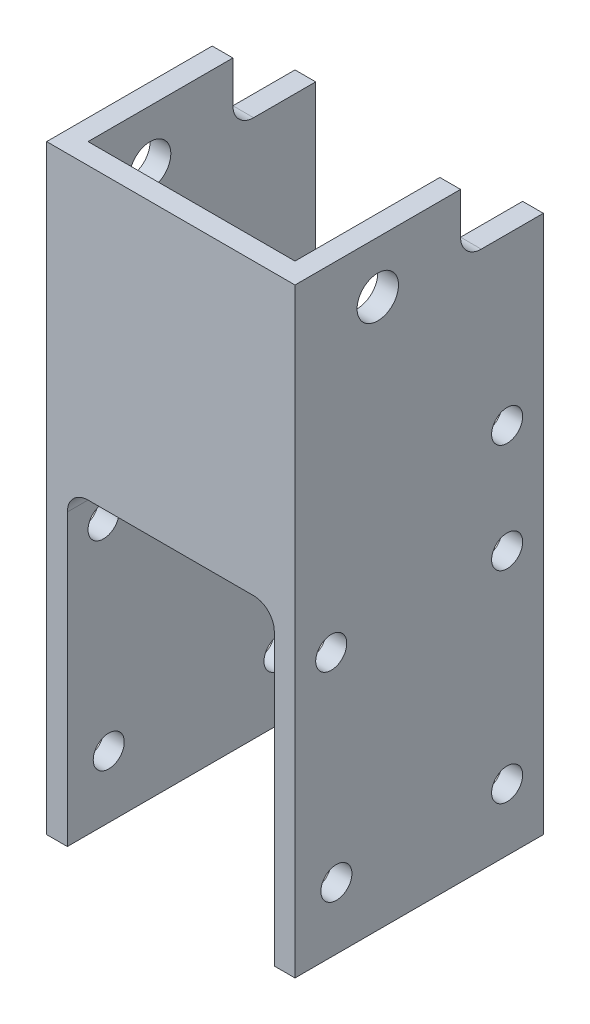
ISO-10303-21;
HEADER;
FILE_DESCRIPTION(('STEP AP214'),'2;1');
FILE_NAME('part.step','',(''),(''),'','','');
FILE_SCHEMA(('AUTOMOTIVE_DESIGN { 1 0 10303 214 1 1 1 1 }'));
ENDSEC;
DATA;
#1=APPLICATION_CONTEXT('core data for automotive mechanical design processes');
#2=APPLICATION_PROTOCOL_DEFINITION('international standard','automotive_design',2000,#1);
#3=PRODUCT_CONTEXT('',#1,'mechanical');
#4=PRODUCT('Part','Part','',(#3));
#5=PRODUCT_RELATED_PRODUCT_CATEGORY('part','',(#4));
#6=PRODUCT_DEFINITION_FORMATION('','',#4);
#7=PRODUCT_DEFINITION_CONTEXT('part definition',#1,'design');
#8=PRODUCT_DEFINITION('design','',#6,#7);
#9=PRODUCT_DEFINITION_SHAPE('','',#8);
#10=(LENGTH_UNIT() NAMED_UNIT(*) SI_UNIT(.MILLI.,.METRE.));
#11=(NAMED_UNIT(*) PLANE_ANGLE_UNIT() SI_UNIT($,.RADIAN.));
#12=(NAMED_UNIT(*) SI_UNIT($,.STERADIAN.) SOLID_ANGLE_UNIT());
#13=UNCERTAINTY_MEASURE_WITH_UNIT(LENGTH_MEASURE(1.E-05),#10,'distance_accuracy_value','');
#14=(GEOMETRIC_REPRESENTATION_CONTEXT(3) GLOBAL_UNCERTAINTY_ASSIGNED_CONTEXT((#13)) GLOBAL_UNIT_ASSIGNED_CONTEXT((#10,
#11,#12)) REPRESENTATION_CONTEXT('',''));
#15=CARTESIAN_POINT('',(0.,0.,0.));
#16=DIRECTION('',(0.,0.,1.));
#17=DIRECTION('',(1.,0.,0.));
#18=AXIS2_PLACEMENT_3D('',#15,#16,#17);
#19=CARTESIAN_POINT('',(0.,0.,0.));
#20=DIRECTION('',(0.,1.,0.));
#21=DIRECTION('',(0.,0.,1.));
#22=AXIS2_PLACEMENT_3D('',#19,#20,#21);
#23=PLANE('',#22);
#24=DIRECTION('',(0.,0.,-1.));
#25=VECTOR('',#24,1.);
#26=CARTESIAN_POINT('',(-31.75,0.,-6.34999999999999));
#27=LINE('',#26,#25);
#28=CARTESIAN_POINT('',(-31.75,0.,0.));
#29=VERTEX_POINT('',#28);
#30=CARTESIAN_POINT('',(-31.75,0.,-76.2));
#31=VERTEX_POINT('',#30);
#32=EDGE_CURVE('E328',#29,#31,#27,.T.);
#33=ORIENTED_EDGE('',*,*,#32,.F.);
#34=DIRECTION('',(1.,0.,0.));
#35=VECTOR('',#34,1.);
#36=CARTESIAN_POINT('',(0.,0.,0.));
#37=LINE('',#36,#35);
#38=CARTESIAN_POINT('',(-38.1,0.,0.));
#39=VERTEX_POINT('',#38);
#40=EDGE_CURVE('E345',#39,#29,#37,.T.);
#41=ORIENTED_EDGE('',*,*,#40,.F.);
#42=DIRECTION('',(0.,0.,1.));
#43=VECTOR('',#42,1.);
#44=CARTESIAN_POINT('',(-38.1,0.,-76.2));
#45=LINE('',#44,#43);
#46=CARTESIAN_POINT('',(-38.1,0.,-76.2));
#47=VERTEX_POINT('',#46);
#48=EDGE_CURVE('E342',#47,#39,#45,.T.);
#49=ORIENTED_EDGE('',*,*,#48,.F.);
#50=DIRECTION('',(-1.,0.,0.));
#51=VECTOR('',#50,1.);
#52=CARTESIAN_POINT('',(-31.75,0.,-76.2));
#53=LINE('',#52,#51);
#54=EDGE_CURVE('E191',#31,#47,#53,.T.);
#55=ORIENTED_EDGE('',*,*,#54,.F.);
#56=EDGE_LOOP('',(#33,#41,#49,#55));
#57=FACE_BOUND('',#56,.T.);
#58=ADVANCED_FACE('F37',(#57),#23,.F.);
#59=CARTESIAN_POINT('',(-31.75,184.15,-76.2));
#60=DIRECTION('',(0.,0.,1.));
#61=DIRECTION('',(1.,0.,0.));
#62=AXIS2_PLACEMENT_3D('',#59,#60,#61);
#63=PLANE('',#62);
#64=DIRECTION('',(0.,-1.,0.));
#65=VECTOR('',#64,1.);
#66=CARTESIAN_POINT('',(-38.1,184.15,-76.2));
#67=LINE('',#66,#65);
#68=CARTESIAN_POINT('',(-38.1,165.1,-76.2000000000001));
#69=VERTEX_POINT('',#68);
#70=EDGE_CURVE('E168',#69,#47,#67,.T.);
#71=ORIENTED_EDGE('',*,*,#70,.F.);
#72=DIRECTION('',(1.,0.,0.));
#73=VECTOR('',#72,1.);
#74=CARTESIAN_POINT('',(-38.1,165.1,-76.2000000000001));
#75=LINE('',#74,#73);
#76=CARTESIAN_POINT('',(-31.75,165.1,-76.2000000000001));
#77=VERTEX_POINT('',#76);
#78=EDGE_CURVE('E179',#69,#77,#75,.T.);
#79=ORIENTED_EDGE('',*,*,#78,.T.);
#80=DIRECTION('',(0.,-1.,0.));
#81=VECTOR('',#80,1.);
#82=CARTESIAN_POINT('',(-31.75,184.15,-76.2));
#83=LINE('',#82,#81);
#84=EDGE_CURVE('E340',#77,#31,#83,.T.);
#85=ORIENTED_EDGE('',*,*,#84,.T.);
#86=ORIENTED_EDGE('',*,*,#54,.T.);
#87=EDGE_LOOP('',(#71,#79,#85,#86));
#88=FACE_BOUND('',#87,.T.);
#89=ADVANCED_FACE('F189',(#88),#63,.F.);
#90=CARTESIAN_POINT('',(-38.1,184.15,-76.2));
#91=DIRECTION('',(1.,0.,0.));
#92=DIRECTION('',(0.,0.,-1.));
#93=AXIS2_PLACEMENT_3D('',#90,#91,#92);
#94=PLANE('',#93);
#95=CARTESIAN_POINT('',(-38.1,80.9752,-11.1125));
#96=DIRECTION('',(1.,0.,0.));
#97=DIRECTION('',(0.,0.,-1.));
#98=AXIS2_PLACEMENT_3D('',#95,#96,#97);
#99=CIRCLE('',#98,4.76249999999998);
#100=CARTESIAN_POINT('',(-38.1,80.9752,-15.875));
#101=VERTEX_POINT('',#100);
#102=EDGE_CURVE('E262',#101,#101,#99,.T.);
#103=ORIENTED_EDGE('',*,*,#102,.T.);
#104=EDGE_LOOP('',(#103));
#105=FACE_BOUND('',#104,.T.);
#106=CARTESIAN_POINT('',(-38.1,80.9752,-65.0875));
#107=DIRECTION('',(1.,0.,0.));
#108=DIRECTION('',(0.,0.,-1.));
#109=AXIS2_PLACEMENT_3D('',#106,#107,#108);
#110=CIRCLE('',#109,4.76249999999998);
#111=CARTESIAN_POINT('',(-38.1,80.9752,-69.85));
#112=VERTEX_POINT('',#111);
#113=EDGE_CURVE('E259',#112,#112,#110,.T.);
#114=ORIENTED_EDGE('',*,*,#113,.T.);
#115=EDGE_LOOP('',(#114));
#116=FACE_BOUND('',#115,.T.);
#117=CARTESIAN_POINT('',(-38.1,168.275,-25.4));
#118=DIRECTION('',(1.,0.,0.));
#119=DIRECTION('',(0.,0.,-1.));
#120=AXIS2_PLACEMENT_3D('',#117,#118,#119);
#121=CIRCLE('',#120,6.34999999999997);
#122=CARTESIAN_POINT('',(-38.1,168.275,-31.75));
#123=VERTEX_POINT('',#122);
#124=EDGE_CURVE('E222',#123,#123,#121,.T.);
#125=ORIENTED_EDGE('',*,*,#124,.T.);
#126=EDGE_LOOP('',(#125));
#127=FACE_BOUND('',#126,.T.);
#128=CARTESIAN_POINT('',(-38.1,19.05,-65.0875));
#129=DIRECTION('',(1.,0.,0.));
#130=DIRECTION('',(0.,0.,-1.));
#131=AXIS2_PLACEMENT_3D('',#128,#129,#130);
#132=CIRCLE('',#131,4.76249999999998);
#133=CARTESIAN_POINT('',(-38.1,19.05,-69.85));
#134=VERTEX_POINT('',#133);
#135=EDGE_CURVE('E214',#134,#134,#132,.T.);
#136=ORIENTED_EDGE('',*,*,#135,.T.);
#137=EDGE_LOOP('',(#136));
#138=FACE_BOUND('',#137,.T.);
#139=CARTESIAN_POINT('',(-38.1,19.05,-12.7));
#140=DIRECTION('',(1.,0.,0.));
#141=DIRECTION('',(0.,0.,-1.));
#142=AXIS2_PLACEMENT_3D('',#139,#140,#141);
#143=CIRCLE('',#142,4.76249999999998);
#144=CARTESIAN_POINT('',(-38.1,19.05,-17.4625));
#145=VERTEX_POINT('',#144);
#146=EDGE_CURVE('E210',#145,#145,#143,.T.);
#147=ORIENTED_EDGE('',*,*,#146,.T.);
#148=EDGE_LOOP('',(#147));
#149=FACE_BOUND('',#148,.T.);
#150=CARTESIAN_POINT('',(-38.1,114.3,-65.0875));
#151=DIRECTION('',(1.,0.,0.));
#152=DIRECTION('',(0.,0.,-1.));
#153=AXIS2_PLACEMENT_3D('',#150,#151,#152);
#154=CIRCLE('',#153,4.76249999999998);
#155=CARTESIAN_POINT('',(-38.1,114.3,-69.85));
#156=VERTEX_POINT('',#155);
#157=EDGE_CURVE('E205',#156,#156,#154,.T.);
#158=ORIENTED_EDGE('',*,*,#157,.T.);
#159=EDGE_LOOP('',(#158));
#160=FACE_BOUND('',#159,.T.);
#161=DIRECTION('',(0.,-1.,0.));
#162=VECTOR('',#161,1.);
#163=CARTESIAN_POINT('',(-38.1,184.15,-50.8000000000001));
#164=LINE('',#163,#162);
#165=CARTESIAN_POINT('',(-38.1,184.15,-50.8000000000001));
#166=VERTEX_POINT('',#165);
#167=CARTESIAN_POINT('',(-38.1,171.45,-50.8000000000001));
#168=VERTEX_POINT('',#167);
#169=EDGE_CURVE('E176',#166,#168,#164,.T.);
#170=ORIENTED_EDGE('',*,*,#169,.T.);
#171=CARTESIAN_POINT('',(-38.1,171.45,-57.1500000000001));
#172=DIRECTION('',(1.,0.,0.));
#173=DIRECTION('',(0.,0.,-1.));
#174=AXIS2_PLACEMENT_3D('',#171,#172,#173);
#175=CIRCLE('',#174,6.35);
#176=CARTESIAN_POINT('',(-38.1,165.1,-57.1500000000001));
#177=VERTEX_POINT('',#176);
#178=EDGE_CURVE('E171',#168,#177,#175,.T.);
#179=ORIENTED_EDGE('',*,*,#178,.T.);
#180=DIRECTION('',(0.,0.,-1.));
#181=VECTOR('',#180,1.);
#182=CARTESIAN_POINT('',(-38.1,165.1,-76.2000000000001));
#183=LINE('',#182,#181);
#184=EDGE_CURVE('E162',#177,#69,#183,.T.);
#185=ORIENTED_EDGE('',*,*,#184,.T.);
#186=ORIENTED_EDGE('',*,*,#70,.T.);
#187=ORIENTED_EDGE('',*,*,#48,.T.);
#188=DIRECTION('',(0.,-1.,0.));
#189=VECTOR('',#188,1.);
#190=CARTESIAN_POINT('',(-38.1,184.15,0.));
#191=LINE('',#190,#189);
#192=CARTESIAN_POINT('',(-38.1,184.15,0.));
#193=VERTEX_POINT('',#192);
#194=EDGE_CURVE('E193',#193,#39,#191,.T.);
#195=ORIENTED_EDGE('',*,*,#194,.F.);
#196=DIRECTION('',(0.,0.,1.));
#197=VECTOR('',#196,1.);
#198=CARTESIAN_POINT('',(-38.1,184.15,-76.2));
#199=LINE('',#198,#197);
#200=EDGE_CURVE('E325',#166,#193,#199,.T.);
#201=ORIENTED_EDGE('',*,*,#200,.F.);
#202=EDGE_LOOP('',(#170,#179,#185,#186,#187,#195,#201));
#203=FACE_BOUND('',#202,.T.);
#204=ADVANCED_FACE('F165',(#105,#116,#127,#138,#149,#160,#203),#94,.F.);
#205=CARTESIAN_POINT('',(0.,184.15,0.));
#206=DIRECTION('',(0.,0.,-1.));
#207=DIRECTION('',(-1.,0.,0.));
#208=AXIS2_PLACEMENT_3D('',#205,#206,#207);
#209=PLANE('',#208);
#210=ORIENTED_EDGE('',*,*,#40,.T.);
#211=DIRECTION('',(0.,1.,0.));
#212=VECTOR('',#211,1.);
#213=CARTESIAN_POINT('',(-31.75,0.,0.));
#214=LINE('',#213,#212);
#215=CARTESIAN_POINT('',(-31.75,88.9,0.));
#216=VERTEX_POINT('',#215);
#217=EDGE_CURVE('E315',#29,#216,#214,.T.);
#218=ORIENTED_EDGE('',*,*,#217,.T.);
#219=CARTESIAN_POINT('',(-25.4,88.9,0.));
#220=DIRECTION('',(0.,0.,-1.));
#221=DIRECTION('',(-1.,0.,0.));
#222=AXIS2_PLACEMENT_3D('',#219,#220,#221);
#223=CIRCLE('',#222,6.35);
#224=CARTESIAN_POINT('',(-25.4,95.25,0.));
#225=VERTEX_POINT('',#224);
#226=EDGE_CURVE('E243',#216,#225,#223,.T.);
#227=ORIENTED_EDGE('',*,*,#226,.T.);
#228=DIRECTION('',(1.,0.,0.));
#229=VECTOR('',#228,1.);
#230=CARTESIAN_POINT('',(-31.75,95.25,0.));
#231=LINE('',#230,#229);
#232=CARTESIAN_POINT('',(25.4,95.25,0.));
#233=VERTEX_POINT('',#232);
#234=EDGE_CURVE('E318',#225,#233,#231,.T.);
#235=ORIENTED_EDGE('',*,*,#234,.T.);
#236=CARTESIAN_POINT('',(25.4,88.9,0.));
#237=DIRECTION('',(0.,0.,-1.));
#238=DIRECTION('',(-1.,0.,0.));
#239=AXIS2_PLACEMENT_3D('',#236,#237,#238);
#240=CIRCLE('',#239,6.35);
#241=CARTESIAN_POINT('',(31.75,88.9,0.));
#242=VERTEX_POINT('',#241);
#243=EDGE_CURVE('E247',#233,#242,#240,.T.);
#244=ORIENTED_EDGE('',*,*,#243,.T.);
#245=DIRECTION('',(0.,-1.,0.));
#246=VECTOR('',#245,1.);
#247=CARTESIAN_POINT('',(31.75,0.,0.));
#248=LINE('',#247,#246);
#249=CARTESIAN_POINT('',(31.75,0.,0.));
#250=VERTEX_POINT('',#249);
#251=EDGE_CURVE('E321',#242,#250,#248,.T.);
#252=ORIENTED_EDGE('',*,*,#251,.T.);
#253=CARTESIAN_POINT('',(38.1,0.,0.));
#254=VERTEX_POINT('',#253);
#255=EDGE_CURVE('E344',#250,#254,#37,.T.);
#256=ORIENTED_EDGE('',*,*,#255,.T.);
#257=DIRECTION('',(0.,-1.,0.));
#258=VECTOR('',#257,1.);
#259=CARTESIAN_POINT('',(38.1,184.15,0.));
#260=LINE('',#259,#258);
#261=CARTESIAN_POINT('',(38.1,184.15,0.));
#262=VERTEX_POINT('',#261);
#263=EDGE_CURVE('E197',#262,#254,#260,.T.);
#264=ORIENTED_EDGE('',*,*,#263,.F.);
#265=DIRECTION('',(1.,0.,0.));
#266=VECTOR('',#265,1.);
#267=CARTESIAN_POINT('',(-38.1,184.15,0.));
#268=LINE('',#267,#266);
#269=EDGE_CURVE('E327',#193,#262,#268,.T.);
#270=ORIENTED_EDGE('',*,*,#269,.F.);
#271=ORIENTED_EDGE('',*,*,#194,.T.);
#272=EDGE_LOOP('',(#210,#218,#227,#235,#244,#252,#256,#264,#270,#271));
#273=FACE_BOUND('',#272,.T.);
#274=ADVANCED_FACE('F402',(#273),#209,.F.);
#275=CARTESIAN_POINT('',(38.1,184.15,0.));
#276=DIRECTION('',(-1.,0.,0.));
#277=DIRECTION('',(0.,0.,1.));
#278=AXIS2_PLACEMENT_3D('',#275,#276,#277);
#279=PLANE('',#278);
#280=CARTESIAN_POINT('',(38.1,80.9752,-11.1125));
#281=DIRECTION('',(1.,0.,0.));
#282=DIRECTION('',(0.,0.,-1.));
#283=AXIS2_PLACEMENT_3D('',#280,#281,#282);
#284=CIRCLE('',#283,4.76249999999999);
#285=CARTESIAN_POINT('',(38.1,80.9752,-15.875));
#286=VERTEX_POINT('',#285);
#287=EDGE_CURVE('E749',#286,#286,#284,.T.);
#288=ORIENTED_EDGE('',*,*,#287,.F.);
#289=EDGE_LOOP('',(#288));
#290=FACE_BOUND('',#289,.T.);
#291=CARTESIAN_POINT('',(38.1,80.9752,-65.0875));
#292=DIRECTION('',(1.,0.,0.));
#293=DIRECTION('',(0.,0.,-1.));
#294=AXIS2_PLACEMENT_3D('',#291,#292,#293);
#295=CIRCLE('',#294,4.76249999999999);
#296=CARTESIAN_POINT('',(38.1,80.9752,-69.85));
#297=VERTEX_POINT('',#296);
#298=EDGE_CURVE('E255',#297,#297,#295,.T.);
#299=ORIENTED_EDGE('',*,*,#298,.F.);
#300=EDGE_LOOP('',(#299));
#301=FACE_BOUND('',#300,.T.);
#302=CARTESIAN_POINT('',(38.1,168.275,-25.4));
#303=DIRECTION('',(1.,0.,0.));
#304=DIRECTION('',(0.,0.,-1.));
#305=AXIS2_PLACEMENT_3D('',#302,#303,#304);
#306=CIRCLE('',#305,6.34999999999999);
#307=CARTESIAN_POINT('',(38.1,168.275,-31.75));
#308=VERTEX_POINT('',#307);
#309=EDGE_CURVE('E273',#308,#308,#306,.T.);
#310=ORIENTED_EDGE('',*,*,#309,.F.);
#311=EDGE_LOOP('',(#310));
#312=FACE_BOUND('',#311,.T.);
#313=CARTESIAN_POINT('',(38.1,19.05,-65.0875));
#314=DIRECTION('',(1.,0.,0.));
#315=DIRECTION('',(0.,0.,-1.));
#316=AXIS2_PLACEMENT_3D('',#313,#314,#315);
#317=CIRCLE('',#316,4.76249999999999);
#318=CARTESIAN_POINT('',(38.1,19.05,-69.85));
#319=VERTEX_POINT('',#318);
#320=EDGE_CURVE('E293',#319,#319,#317,.T.);
#321=ORIENTED_EDGE('',*,*,#320,.F.);
#322=EDGE_LOOP('',(#321));
#323=FACE_BOUND('',#322,.T.);
#324=CARTESIAN_POINT('',(38.1,19.05,-12.7));
#325=DIRECTION('',(1.,0.,0.));
#326=DIRECTION('',(0.,0.,-1.));
#327=AXIS2_PLACEMENT_3D('',#324,#325,#326);
#328=CIRCLE('',#327,4.76249999999999);
#329=CARTESIAN_POINT('',(38.1,19.05,-17.4625));
#330=VERTEX_POINT('',#329);
#331=EDGE_CURVE('E300',#330,#330,#328,.T.);
#332=ORIENTED_EDGE('',*,*,#331,.F.);
#333=EDGE_LOOP('',(#332));
#334=FACE_BOUND('',#333,.T.);
#335=CARTESIAN_POINT('',(38.1,114.3,-65.0875));
#336=DIRECTION('',(1.,0.,0.));
#337=DIRECTION('',(0.,0.,-1.));
#338=AXIS2_PLACEMENT_3D('',#335,#336,#337);
#339=CIRCLE('',#338,4.76249999999999);
#340=CARTESIAN_POINT('',(38.1,114.3,-69.85));
#341=VERTEX_POINT('',#340);
#342=EDGE_CURVE('E307',#341,#341,#339,.T.);
#343=ORIENTED_EDGE('',*,*,#342,.F.);
#344=EDGE_LOOP('',(#343));
#345=FACE_BOUND('',#344,.T.);
#346=DIRECTION('',(0.,-1.,0.));
#347=VECTOR('',#346,1.);
#348=CARTESIAN_POINT('',(38.1,184.15,-76.2000000000001));
#349=LINE('',#348,#347);
#350=CARTESIAN_POINT('',(38.1,165.1,-76.2000000000001));
#351=VERTEX_POINT('',#350);
#352=CARTESIAN_POINT('',(38.1,0.,-76.2000000000001));
#353=VERTEX_POINT('',#352);
#354=EDGE_CURVE('E366',#351,#353,#349,.T.);
#355=ORIENTED_EDGE('',*,*,#354,.F.);
#356=DIRECTION('',(0.,0.,-1.));
#357=VECTOR('',#356,1.);
#358=CARTESIAN_POINT('',(38.1,165.1,-76.2000000000001));
#359=LINE('',#358,#357);
#360=CARTESIAN_POINT('',(38.1,165.1,-57.1500000000001));
#361=VERTEX_POINT('',#360);
#362=EDGE_CURVE('E281',#361,#351,#359,.T.);
#363=ORIENTED_EDGE('',*,*,#362,.F.);
#364=CARTESIAN_POINT('',(38.1,171.45,-57.1500000000001));
#365=DIRECTION('',(-1.,0.,0.));
#366=DIRECTION('',(0.,0.,1.));
#367=AXIS2_PLACEMENT_3D('',#364,#365,#366);
#368=CIRCLE('',#367,6.35);
#369=CARTESIAN_POINT('',(38.1,171.45,-50.8000000000001));
#370=VERTEX_POINT('',#369);
#371=EDGE_CURVE('E46',#361,#370,#368,.T.);
#372=ORIENTED_EDGE('',*,*,#371,.T.);
#373=DIRECTION('',(0.,-1.,0.));
#374=VECTOR('',#373,1.);
#375=CARTESIAN_POINT('',(38.1,184.15,-50.8000000000001));
#376=LINE('',#375,#374);
#377=CARTESIAN_POINT('',(38.1,184.15,-50.8000000000001));
#378=VERTEX_POINT('',#377);
#379=EDGE_CURVE('E280',#378,#370,#376,.T.);
#380=ORIENTED_EDGE('',*,*,#379,.F.);
#381=DIRECTION('',(0.,0.,-1.));
#382=VECTOR('',#381,1.);
#383=CARTESIAN_POINT('',(38.1,184.15,0.));
#384=LINE('',#383,#382);
#385=EDGE_CURVE('E330',#262,#378,#384,.T.);
#386=ORIENTED_EDGE('',*,*,#385,.F.);
#387=ORIENTED_EDGE('',*,*,#263,.T.);
#388=DIRECTION('',(0.,0.,-1.));
#389=VECTOR('',#388,1.);
#390=CARTESIAN_POINT('',(38.1,0.,0.));
#391=LINE('',#390,#389);
#392=EDGE_CURVE('E348',#254,#353,#391,.T.);
#393=ORIENTED_EDGE('',*,*,#392,.T.);
#394=EDGE_LOOP('',(#355,#363,#372,#380,#386,#387,#393));
#395=FACE_BOUND('',#394,.T.);
#396=ADVANCED_FACE('F372',(#290,#301,#312,#323,#334,#345,#395),#279,.F.);
#397=CARTESIAN_POINT('',(38.1,184.15,-76.2000000000001));
#398=DIRECTION('',(0.,0.,1.));
#399=DIRECTION('',(1.,0.,0.));
#400=AXIS2_PLACEMENT_3D('',#397,#398,#399);
#401=PLANE('',#400);
#402=DIRECTION('',(0.,-1.,0.));
#403=VECTOR('',#402,1.);
#404=CARTESIAN_POINT('',(31.75,184.15,-76.2));
#405=LINE('',#404,#403);
#406=CARTESIAN_POINT('',(31.75,165.1,-76.2000000000001));
#407=VERTEX_POINT('',#406);
#408=CARTESIAN_POINT('',(31.75,0.,-76.2));
#409=VERTEX_POINT('',#408);
#410=EDGE_CURVE('E364',#407,#409,#405,.T.);
#411=ORIENTED_EDGE('',*,*,#410,.F.);
#412=EDGE_CURVE('E186',#407,#351,#75,.T.);
#413=ORIENTED_EDGE('',*,*,#412,.T.);
#414=ORIENTED_EDGE('',*,*,#354,.T.);
#415=DIRECTION('',(-1.,0.,0.));
#416=VECTOR('',#415,1.);
#417=CARTESIAN_POINT('',(38.1,0.,-76.2000000000001));
#418=LINE('',#417,#416);
#419=EDGE_CURVE('E351',#353,#409,#418,.T.);
#420=ORIENTED_EDGE('',*,*,#419,.T.);
#421=EDGE_LOOP('',(#411,#413,#414,#420));
#422=FACE_BOUND('',#421,.T.);
#423=ADVANCED_FACE('F382',(#422),#401,.F.);
#424=CARTESIAN_POINT('',(31.75,184.15,-76.2));
#425=DIRECTION('',(1.,0.,0.));
#426=DIRECTION('',(0.,0.,-1.));
#427=AXIS2_PLACEMENT_3D('',#424,#425,#426);
#428=PLANE('',#427);
#429=CARTESIAN_POINT('',(31.75,80.9752,-11.1125));
#430=DIRECTION('',(1.,0.,0.));
#431=DIRECTION('',(0.,0.,-1.));
#432=AXIS2_PLACEMENT_3D('',#429,#430,#431);
#433=CIRCLE('',#432,4.76249999999998);
#434=CARTESIAN_POINT('',(31.75,80.9752,-15.875));
#435=VERTEX_POINT('',#434);
#436=EDGE_CURVE('E267',#435,#435,#433,.T.);
#437=ORIENTED_EDGE('',*,*,#436,.T.);
#438=EDGE_LOOP('',(#437));
#439=FACE_BOUND('',#438,.T.);
#440=CARTESIAN_POINT('',(31.75,80.9752,-65.0875));
#441=DIRECTION('',(1.,0.,0.));
#442=DIRECTION('',(0.,0.,-1.));
#443=AXIS2_PLACEMENT_3D('',#440,#441,#442);
#444=CIRCLE('',#443,4.76249999999998);
#445=CARTESIAN_POINT('',(31.75,80.9752,-69.85));
#446=VERTEX_POINT('',#445);
#447=EDGE_CURVE('E254',#446,#446,#444,.T.);
#448=ORIENTED_EDGE('',*,*,#447,.T.);
#449=EDGE_LOOP('',(#448));
#450=FACE_BOUND('',#449,.T.);
#451=CARTESIAN_POINT('',(31.75,168.275,-25.4));
#452=DIRECTION('',(1.,0.,0.));
#453=DIRECTION('',(0.,0.,-1.));
#454=AXIS2_PLACEMENT_3D('',#451,#452,#453);
#455=CIRCLE('',#454,6.34999999999998);
#456=CARTESIAN_POINT('',(31.75,168.275,-31.75));
#457=VERTEX_POINT('',#456);
#458=EDGE_CURVE('E221',#457,#457,#455,.T.);
#459=ORIENTED_EDGE('',*,*,#458,.T.);
#460=EDGE_LOOP('',(#459));
#461=FACE_BOUND('',#460,.T.);
#462=CARTESIAN_POINT('',(31.75,19.05,-65.0875));
#463=DIRECTION('',(1.,0.,0.));
#464=DIRECTION('',(0.,0.,-1.));
#465=AXIS2_PLACEMENT_3D('',#462,#463,#464);
#466=CIRCLE('',#465,4.76249999999998);
#467=CARTESIAN_POINT('',(31.75,19.05,-69.85));
#468=VERTEX_POINT('',#467);
#469=EDGE_CURVE('E213',#468,#468,#466,.T.);
#470=ORIENTED_EDGE('',*,*,#469,.T.);
#471=EDGE_LOOP('',(#470));
#472=FACE_BOUND('',#471,.T.);
#473=CARTESIAN_POINT('',(31.75,19.05,-12.7));
#474=DIRECTION('',(1.,0.,0.));
#475=DIRECTION('',(0.,0.,-1.));
#476=AXIS2_PLACEMENT_3D('',#473,#474,#475);
#477=CIRCLE('',#476,4.76249999999999);
#478=CARTESIAN_POINT('',(31.75,19.05,-17.4625));
#479=VERTEX_POINT('',#478);
#480=EDGE_CURVE('E209',#479,#479,#477,.T.);
#481=ORIENTED_EDGE('',*,*,#480,.T.);
#482=EDGE_LOOP('',(#481));
#483=FACE_BOUND('',#482,.T.);
#484=CARTESIAN_POINT('',(31.75,114.3,-65.0875));
#485=DIRECTION('',(1.,0.,0.));
#486=DIRECTION('',(0.,0.,-1.));
#487=AXIS2_PLACEMENT_3D('',#484,#485,#486);
#488=CIRCLE('',#487,4.76249999999998);
#489=CARTESIAN_POINT('',(31.75,114.3,-69.85));
#490=VERTEX_POINT('',#489);
#491=EDGE_CURVE('E204',#490,#490,#488,.T.);
#492=ORIENTED_EDGE('',*,*,#491,.T.);
#493=EDGE_LOOP('',(#492));
#494=FACE_BOUND('',#493,.T.);
#495=ORIENTED_EDGE('',*,*,#251,.F.);
#496=DIRECTION('',(0.,0.,-1.));
#497=VECTOR('',#496,1.);
#498=CARTESIAN_POINT('',(31.75,88.9,-6.35));
#499=LINE('',#498,#497);
#500=CARTESIAN_POINT('',(31.75,88.9,-6.35));
#501=VERTEX_POINT('',#500);
#502=EDGE_CURVE('E229',#242,#501,#499,.T.);
#503=ORIENTED_EDGE('',*,*,#502,.T.);
#504=DIRECTION('',(0.,-1.,0.));
#505=VECTOR('',#504,1.);
#506=CARTESIAN_POINT('',(31.75,184.15,-6.35));
#507=LINE('',#506,#505);
#508=CARTESIAN_POINT('',(31.75,184.15,-6.35));
#509=VERTEX_POINT('',#508);
#510=EDGE_CURVE('E362',#509,#501,#507,.T.);
#511=ORIENTED_EDGE('',*,*,#510,.F.);
#512=DIRECTION('',(0.,0.,1.));
#513=VECTOR('',#512,1.);
#514=CARTESIAN_POINT('',(31.75,184.15,-76.2));
#515=LINE('',#514,#513);
#516=CARTESIAN_POINT('',(31.75,184.15,-50.8000000000001));
#517=VERTEX_POINT('',#516);
#518=EDGE_CURVE('E333',#517,#509,#515,.T.);
#519=ORIENTED_EDGE('',*,*,#518,.F.);
#520=DIRECTION('',(0.,-1.,0.));
#521=VECTOR('',#520,1.);
#522=CARTESIAN_POINT('',(31.75,184.15,-50.8000000000001));
#523=LINE('',#522,#521);
#524=CARTESIAN_POINT('',(31.75,171.45,-50.8000000000001));
#525=VERTEX_POINT('',#524);
#526=EDGE_CURVE('E288',#517,#525,#523,.T.);
#527=ORIENTED_EDGE('',*,*,#526,.T.);
#528=CARTESIAN_POINT('',(31.75,171.45,-57.1500000000001));
#529=DIRECTION('',(1.,0.,0.));
#530=DIRECTION('',(0.,0.,-1.));
#531=AXIS2_PLACEMENT_3D('',#528,#529,#530);
#532=CIRCLE('',#531,6.35);
#533=CARTESIAN_POINT('',(31.75,165.1,-57.1500000000001));
#534=VERTEX_POINT('',#533);
#535=EDGE_CURVE('E11',#525,#534,#532,.T.);
#536=ORIENTED_EDGE('',*,*,#535,.T.);
#537=DIRECTION('',(0.,0.,-1.));
#538=VECTOR('',#537,1.);
#539=CARTESIAN_POINT('',(31.75,165.1,-76.2));
#540=LINE('',#539,#538);
#541=EDGE_CURVE('E291',#534,#407,#540,.T.);
#542=ORIENTED_EDGE('',*,*,#541,.T.);
#543=ORIENTED_EDGE('',*,*,#410,.T.);
#544=DIRECTION('',(0.,0.,1.));
#545=VECTOR('',#544,1.);
#546=CARTESIAN_POINT('',(31.75,0.,-76.2));
#547=LINE('',#546,#545);
#548=EDGE_CURVE('E354',#409,#250,#547,.T.);
#549=ORIENTED_EDGE('',*,*,#548,.T.);
#550=EDGE_LOOP('',(#495,#503,#511,#519,#527,#536,#542,#543,#549));
#551=FACE_BOUND('',#550,.T.);
#552=ADVANCED_FACE('F391',(#439,#450,#461,#472,#483,#494,#551),#428,.F.);
#553=CARTESIAN_POINT('',(31.75,184.15,-6.35));
#554=DIRECTION('',(0.,0.,1.));
#555=DIRECTION('',(1.,0.,0.));
#556=AXIS2_PLACEMENT_3D('',#553,#554,#555);
#557=PLANE('',#556);
#558=ORIENTED_EDGE('',*,*,#510,.T.);
#559=CARTESIAN_POINT('',(25.4,88.9,-6.35000000000001));
#560=DIRECTION('',(0.,0.,1.));
#561=DIRECTION('',(1.,0.,0.));
#562=AXIS2_PLACEMENT_3D('',#559,#560,#561);
#563=CIRCLE('',#562,6.35);
#564=CARTESIAN_POINT('',(25.4,95.25,-6.35));
#565=VERTEX_POINT('',#564);
#566=EDGE_CURVE('E245',#501,#565,#563,.T.);
#567=ORIENTED_EDGE('',*,*,#566,.T.);
#568=DIRECTION('',(1.,0.,0.));
#569=VECTOR('',#568,1.);
#570=CARTESIAN_POINT('',(-31.75,95.25,-6.35));
#571=LINE('',#570,#569);
#572=CARTESIAN_POINT('',(-25.4,95.25,-6.35));
#573=VERTEX_POINT('',#572);
#574=EDGE_CURVE('E314',#573,#565,#571,.T.);
#575=ORIENTED_EDGE('',*,*,#574,.F.);
#576=CARTESIAN_POINT('',(-25.4,88.9,-6.35));
#577=DIRECTION('',(0.,0.,1.));
#578=DIRECTION('',(1.,0.,0.));
#579=AXIS2_PLACEMENT_3D('',#576,#577,#578);
#580=CIRCLE('',#579,6.35);
#581=CARTESIAN_POINT('',(-31.75,88.9,-6.34999999999999));
#582=VERTEX_POINT('',#581);
#583=EDGE_CURVE('E240',#573,#582,#580,.T.);
#584=ORIENTED_EDGE('',*,*,#583,.T.);
#585=DIRECTION('',(0.,-1.,0.));
#586=VECTOR('',#585,1.);
#587=CARTESIAN_POINT('',(-31.75,184.15,-6.34999999999999));
#588=LINE('',#587,#586);
#589=CARTESIAN_POINT('',(-31.75,184.15,-6.34999999999999));
#590=VERTEX_POINT('',#589);
#591=EDGE_CURVE('E360',#590,#582,#588,.T.);
#592=ORIENTED_EDGE('',*,*,#591,.F.);
#593=DIRECTION('',(-1.,0.,0.));
#594=VECTOR('',#593,1.);
#595=CARTESIAN_POINT('',(31.75,184.15,-6.35));
#596=LINE('',#595,#594);
#597=EDGE_CURVE('E335',#509,#590,#596,.T.);
#598=ORIENTED_EDGE('',*,*,#597,.F.);
#599=EDGE_LOOP('',(#558,#567,#575,#584,#592,#598));
#600=FACE_BOUND('',#599,.T.);
#601=ADVANCED_FACE('F418',(#600),#557,.F.);
#602=CARTESIAN_POINT('',(-31.75,184.15,-6.34999999999999));
#603=DIRECTION('',(-1.,0.,0.));
#604=DIRECTION('',(0.,0.,1.));
#605=AXIS2_PLACEMENT_3D('',#602,#603,#604);
#606=PLANE('',#605);
#607=CARTESIAN_POINT('',(-31.75,80.9752,-11.1125));
#608=DIRECTION('',(-1.,0.,0.));
#609=DIRECTION('',(0.,0.,1.));
#610=AXIS2_PLACEMENT_3D('',#607,#608,#609);
#611=CIRCLE('',#610,4.76249999999998);
#612=CARTESIAN_POINT('',(-31.75,80.9752,-6.35000000000001));
#613=VERTEX_POINT('',#612);
#614=EDGE_CURVE('E41',#613,#613,#611,.T.);
#615=ORIENTED_EDGE('',*,*,#614,.T.);
#616=EDGE_LOOP('',(#615));
#617=FACE_BOUND('',#616,.T.);
#618=CARTESIAN_POINT('',(-31.75,80.9752,-65.0875));
#619=DIRECTION('',(-1.,0.,0.));
#620=DIRECTION('',(0.,0.,1.));
#621=AXIS2_PLACEMENT_3D('',#618,#619,#620);
#622=CIRCLE('',#621,4.76249999999998);
#623=CARTESIAN_POINT('',(-31.75,80.9752,-60.325));
#624=VERTEX_POINT('',#623);
#625=EDGE_CURVE('E252',#624,#624,#622,.T.);
#626=ORIENTED_EDGE('',*,*,#625,.T.);
#627=EDGE_LOOP('',(#626));
#628=FACE_BOUND('',#627,.T.);
#629=CARTESIAN_POINT('',(-31.75,168.275,-25.4));
#630=DIRECTION('',(-1.,0.,0.));
#631=DIRECTION('',(0.,0.,1.));
#632=AXIS2_PLACEMENT_3D('',#629,#630,#631);
#633=CIRCLE('',#632,6.34999999999998);
#634=CARTESIAN_POINT('',(-31.75,168.275,-19.05));
#635=VERTEX_POINT('',#634);
#636=EDGE_CURVE('E218',#635,#635,#633,.T.);
#637=ORIENTED_EDGE('',*,*,#636,.T.);
#638=EDGE_LOOP('',(#637));
#639=FACE_BOUND('',#638,.T.);
#640=CARTESIAN_POINT('',(-31.75,19.05,-65.0875));
#641=DIRECTION('',(-1.,0.,0.));
#642=DIRECTION('',(0.,0.,1.));
#643=AXIS2_PLACEMENT_3D('',#640,#641,#642);
#644=CIRCLE('',#643,4.76249999999998);
#645=CARTESIAN_POINT('',(-31.75,19.05,-60.325));
#646=VERTEX_POINT('',#645);
#647=EDGE_CURVE('E211',#646,#646,#644,.T.);
#648=ORIENTED_EDGE('',*,*,#647,.T.);
#649=EDGE_LOOP('',(#648));
#650=FACE_BOUND('',#649,.T.);
#651=CARTESIAN_POINT('',(-31.75,19.05,-12.7));
#652=DIRECTION('',(-1.,0.,0.));
#653=DIRECTION('',(0.,0.,1.));
#654=AXIS2_PLACEMENT_3D('',#651,#652,#653);
#655=CIRCLE('',#654,4.76249999999999);
#656=CARTESIAN_POINT('',(-31.75,19.05,-7.93750000000001));
#657=VERTEX_POINT('',#656);
#658=EDGE_CURVE('E206',#657,#657,#655,.T.);
#659=ORIENTED_EDGE('',*,*,#658,.T.);
#660=EDGE_LOOP('',(#659));
#661=FACE_BOUND('',#660,.T.);
#662=CARTESIAN_POINT('',(-31.75,114.3,-65.0875));
#663=DIRECTION('',(-1.,0.,0.));
#664=DIRECTION('',(0.,0.,1.));
#665=AXIS2_PLACEMENT_3D('',#662,#663,#664);
#666=CIRCLE('',#665,4.76249999999998);
#667=CARTESIAN_POINT('',(-31.75,114.3,-60.325));
#668=VERTEX_POINT('',#667);
#669=EDGE_CURVE('E201',#668,#668,#666,.T.);
#670=ORIENTED_EDGE('',*,*,#669,.T.);
#671=EDGE_LOOP('',(#670));
#672=FACE_BOUND('',#671,.T.);
#673=ORIENTED_EDGE('',*,*,#591,.T.);
#674=DIRECTION('',(0.,0.,-1.));
#675=VECTOR('',#674,1.);
#676=CARTESIAN_POINT('',(-31.75,88.9,0.));
#677=LINE('',#676,#675);
#678=EDGE_CURVE('E227',#582,#216,#677,.F.);
#679=ORIENTED_EDGE('',*,*,#678,.T.);
#680=ORIENTED_EDGE('',*,*,#217,.F.);
#681=ORIENTED_EDGE('',*,*,#32,.T.);
#682=ORIENTED_EDGE('',*,*,#84,.F.);
#683=DIRECTION('',(0.,0.,1.));
#684=VECTOR('',#683,1.);
#685=CARTESIAN_POINT('',(-31.75,165.1,-6.35000000000002));
#686=LINE('',#685,#684);
#687=CARTESIAN_POINT('',(-31.75,165.1,-57.1500000000001));
#688=VERTEX_POINT('',#687);
#689=EDGE_CURVE('E182',#77,#688,#686,.T.);
#690=ORIENTED_EDGE('',*,*,#689,.T.);
#691=CARTESIAN_POINT('',(-31.75,171.45,-57.1500000000001));
#692=DIRECTION('',(-1.,0.,0.));
#693=DIRECTION('',(0.,0.,1.));
#694=AXIS2_PLACEMENT_3D('',#691,#692,#693);
#695=CIRCLE('',#694,6.35);
#696=CARTESIAN_POINT('',(-31.75,171.45,-50.8000000000001));
#697=VERTEX_POINT('',#696);
#698=EDGE_CURVE('E249',#688,#697,#695,.T.);
#699=ORIENTED_EDGE('',*,*,#698,.T.);
#700=DIRECTION('',(0.,1.,0.));
#701=VECTOR('',#700,1.);
#702=CARTESIAN_POINT('',(-31.75,184.15,-50.8000000000001));
#703=LINE('',#702,#701);
#704=CARTESIAN_POINT('',(-31.75,184.15,-50.8000000000001));
#705=VERTEX_POINT('',#704);
#706=EDGE_CURVE('E185',#697,#705,#703,.T.);
#707=ORIENTED_EDGE('',*,*,#706,.T.);
#708=DIRECTION('',(0.,0.,-1.));
#709=VECTOR('',#708,1.);
#710=CARTESIAN_POINT('',(-31.75,184.15,-6.34999999999999));
#711=LINE('',#710,#709);
#712=EDGE_CURVE('E337',#590,#705,#711,.T.);
#713=ORIENTED_EDGE('',*,*,#712,.F.);
#714=EDGE_LOOP('',(#673,#679,#680,#681,#682,#690,#699,#707,#713));
#715=FACE_BOUND('',#714,.T.);
#716=ADVANCED_FACE('F406',(#617,#628,#639,#650,#661,#672,#715),#606,.F.);
#717=CARTESIAN_POINT('',(0.,184.15,0.));
#718=DIRECTION('',(0.,1.,0.));
#719=DIRECTION('',(0.,0.,1.));
#720=AXIS2_PLACEMENT_3D('',#717,#718,#719);
#721=PLANE('',#720);
#722=DIRECTION('',(1.,0.,0.));
#723=VECTOR('',#722,1.);
#724=CARTESIAN_POINT('',(-38.1,184.15,-50.8000000000001));
#725=LINE('',#724,#723);
#726=EDGE_CURVE('E175',#166,#705,#725,.T.);
#727=ORIENTED_EDGE('',*,*,#726,.F.);
#728=ORIENTED_EDGE('',*,*,#200,.T.);
#729=ORIENTED_EDGE('',*,*,#269,.T.);
#730=ORIENTED_EDGE('',*,*,#385,.T.);
#731=DIRECTION('',(1.,0.,0.));
#732=VECTOR('',#731,1.);
#733=CARTESIAN_POINT('',(0.,184.15,-50.8000000000001));
#734=LINE('',#733,#732);
#735=EDGE_CURVE('E192',#517,#378,#734,.T.);
#736=ORIENTED_EDGE('',*,*,#735,.F.);
#737=ORIENTED_EDGE('',*,*,#518,.T.);
#738=ORIENTED_EDGE('',*,*,#597,.T.);
#739=ORIENTED_EDGE('',*,*,#712,.T.);
#740=EDGE_LOOP('',(#727,#728,#729,#730,#736,#737,#738,#739));
#741=FACE_BOUND('',#740,.T.);
#742=ADVANCED_FACE('F399',(#741),#721,.T.);
#743=ORIENTED_EDGE('',*,*,#255,.F.);
#744=ORIENTED_EDGE('',*,*,#548,.F.);
#745=ORIENTED_EDGE('',*,*,#419,.F.);
#746=ORIENTED_EDGE('',*,*,#392,.F.);
#747=EDGE_LOOP('',(#743,#744,#745,#746));
#748=FACE_BOUND('',#747,.T.);
#749=ADVANCED_FACE('F378',(#748),#23,.F.);
#750=CARTESIAN_POINT('',(-31.75,95.25,0.));
#751=DIRECTION('',(0.,1.,0.));
#752=DIRECTION('',(0.,0.,1.));
#753=AXIS2_PLACEMENT_3D('',#750,#751,#752);
#754=PLANE('',#753);
#755=ORIENTED_EDGE('',*,*,#234,.F.);
#756=DIRECTION('',(0.,0.,-1.));
#757=VECTOR('',#756,1.);
#758=CARTESIAN_POINT('',(-25.4,95.25,-6.35));
#759=LINE('',#758,#757);
#760=EDGE_CURVE('E224',#225,#573,#759,.T.);
#761=ORIENTED_EDGE('',*,*,#760,.T.);
#762=ORIENTED_EDGE('',*,*,#574,.T.);
#763=DIRECTION('',(0.,0.,-1.));
#764=VECTOR('',#763,1.);
#765=CARTESIAN_POINT('',(25.4,95.25,0.));
#766=LINE('',#765,#764);
#767=EDGE_CURVE('E217',#565,#233,#766,.F.);
#768=ORIENTED_EDGE('',*,*,#767,.T.);
#769=EDGE_LOOP('',(#755,#761,#762,#768));
#770=FACE_BOUND('',#769,.T.);
#771=ADVANCED_FACE('F415',(#770),#754,.F.);
#772=CARTESIAN_POINT('',(38.1,114.3,-65.0875));
#773=DIRECTION('',(1.,0.,0.));
#774=DIRECTION('',(0.,0.,-1.));
#775=AXIS2_PLACEMENT_3D('',#772,#773,#774);
#776=CYLINDRICAL_SURFACE('',#775,4.76249999999998);
#777=ORIENTED_EDGE('',*,*,#157,.F.);
#778=EDGE_LOOP('',(#777));
#779=FACE_BOUND('',#778,.T.);
#780=ORIENTED_EDGE('',*,*,#669,.F.);
#781=EDGE_LOOP('',(#780));
#782=FACE_BOUND('',#781,.T.);
#783=ADVANCED_FACE('F453',(#779,#782),#776,.F.);
#784=ORIENTED_EDGE('',*,*,#342,.T.);
#785=EDGE_LOOP('',(#784));
#786=FACE_BOUND('',#785,.T.);
#787=ORIENTED_EDGE('',*,*,#491,.F.);
#788=EDGE_LOOP('',(#787));
#789=FACE_BOUND('',#788,.T.);
#790=ADVANCED_FACE('F460',(#786,#789),#776,.F.);
#791=CARTESIAN_POINT('',(38.1,19.05,-12.7));
#792=DIRECTION('',(1.,0.,0.));
#793=DIRECTION('',(0.,0.,-1.));
#794=AXIS2_PLACEMENT_3D('',#791,#792,#793);
#795=CYLINDRICAL_SURFACE('',#794,4.76249999999999);
#796=ORIENTED_EDGE('',*,*,#146,.F.);
#797=EDGE_LOOP('',(#796));
#798=FACE_BOUND('',#797,.T.);
#799=ORIENTED_EDGE('',*,*,#658,.F.);
#800=EDGE_LOOP('',(#799));
#801=FACE_BOUND('',#800,.T.);
#802=ADVANCED_FACE('F463',(#798,#801),#795,.F.);
#803=ORIENTED_EDGE('',*,*,#331,.T.);
#804=EDGE_LOOP('',(#803));
#805=FACE_BOUND('',#804,.T.);
#806=ORIENTED_EDGE('',*,*,#480,.F.);
#807=EDGE_LOOP('',(#806));
#808=FACE_BOUND('',#807,.T.);
#809=ADVANCED_FACE('F465',(#805,#808),#795,.F.);
#810=CARTESIAN_POINT('',(38.1,19.05,-65.0875));
#811=DIRECTION('',(1.,0.,0.));
#812=DIRECTION('',(0.,0.,-1.));
#813=AXIS2_PLACEMENT_3D('',#810,#811,#812);
#814=CYLINDRICAL_SURFACE('',#813,4.76249999999998);
#815=ORIENTED_EDGE('',*,*,#135,.F.);
#816=EDGE_LOOP('',(#815));
#817=FACE_BOUND('',#816,.T.);
#818=ORIENTED_EDGE('',*,*,#647,.F.);
#819=EDGE_LOOP('',(#818));
#820=FACE_BOUND('',#819,.T.);
#821=ADVANCED_FACE('F468',(#817,#820),#814,.F.);
#822=ORIENTED_EDGE('',*,*,#320,.T.);
#823=EDGE_LOOP('',(#822));
#824=FACE_BOUND('',#823,.T.);
#825=ORIENTED_EDGE('',*,*,#469,.F.);
#826=EDGE_LOOP('',(#825));
#827=FACE_BOUND('',#826,.T.);
#828=ADVANCED_FACE('F470',(#824,#827),#814,.F.);
#829=CARTESIAN_POINT('',(-38.1,184.15,-50.8000000000001));
#830=DIRECTION('',(0.,0.,1.));
#831=DIRECTION('',(0.,-1.,0.));
#832=AXIS2_PLACEMENT_3D('',#829,#830,#831);
#833=PLANE('',#832);
#834=ORIENTED_EDGE('',*,*,#379,.T.);
#835=DIRECTION('',(1.,0.,0.));
#836=VECTOR('',#835,1.);
#837=CARTESIAN_POINT('',(31.75,171.45,-50.8000000000001));
#838=LINE('',#837,#836);
#839=EDGE_CURVE('E238',#370,#525,#838,.F.);
#840=ORIENTED_EDGE('',*,*,#839,.T.);
#841=ORIENTED_EDGE('',*,*,#526,.F.);
#842=ORIENTED_EDGE('',*,*,#735,.T.);
#843=EDGE_LOOP('',(#834,#840,#841,#842));
#844=FACE_BOUND('',#843,.T.);
#845=ADVANCED_FACE('F396',(#844),#833,.F.);
#846=CARTESIAN_POINT('',(-38.1,165.1,-76.2000000000001));
#847=DIRECTION('',(0.,-1.,0.));
#848=DIRECTION('',(0.,0.,-1.));
#849=AXIS2_PLACEMENT_3D('',#846,#847,#848);
#850=PLANE('',#849);
#851=ORIENTED_EDGE('',*,*,#541,.F.);
#852=DIRECTION('',(1.,0.,0.));
#853=VECTOR('',#852,1.);
#854=CARTESIAN_POINT('',(38.1,165.1,-57.1500000000001));
#855=LINE('',#854,#853);
#856=EDGE_CURVE('E236',#534,#361,#855,.T.);
#857=ORIENTED_EDGE('',*,*,#856,.T.);
#858=ORIENTED_EDGE('',*,*,#362,.T.);
#859=ORIENTED_EDGE('',*,*,#412,.F.);
#860=EDGE_LOOP('',(#851,#857,#858,#859));
#861=FACE_BOUND('',#860,.T.);
#862=ADVANCED_FACE('F387',(#861),#850,.F.);
#863=ORIENTED_EDGE('',*,*,#184,.F.);
#864=DIRECTION('',(1.,0.,0.));
#865=VECTOR('',#864,1.);
#866=CARTESIAN_POINT('',(-31.75,165.1,-57.1500000000001));
#867=LINE('',#866,#865);
#868=EDGE_CURVE('E232',#177,#688,#867,.T.);
#869=ORIENTED_EDGE('',*,*,#868,.T.);
#870=ORIENTED_EDGE('',*,*,#689,.F.);
#871=ORIENTED_EDGE('',*,*,#78,.F.);
#872=EDGE_LOOP('',(#863,#869,#870,#871));
#873=FACE_BOUND('',#872,.T.);
#874=ADVANCED_FACE('F180',(#873),#850,.F.);
#875=ORIENTED_EDGE('',*,*,#706,.F.);
#876=DIRECTION('',(1.,0.,0.));
#877=VECTOR('',#876,1.);
#878=CARTESIAN_POINT('',(-38.1,171.45,-50.8000000000001));
#879=LINE('',#878,#877);
#880=EDGE_CURVE('E234',#697,#168,#879,.F.);
#881=ORIENTED_EDGE('',*,*,#880,.T.);
#882=ORIENTED_EDGE('',*,*,#169,.F.);
#883=ORIENTED_EDGE('',*,*,#726,.T.);
#884=EDGE_LOOP('',(#875,#881,#882,#883));
#885=FACE_BOUND('',#884,.T.);
#886=ADVANCED_FACE('F430',(#885),#833,.F.);
#887=CARTESIAN_POINT('',(38.1,168.275,-25.4));
#888=DIRECTION('',(1.,0.,0.));
#889=DIRECTION('',(0.,0.,-1.));
#890=AXIS2_PLACEMENT_3D('',#887,#888,#889);
#891=CYLINDRICAL_SURFACE('',#890,6.34999999999998);
#892=ORIENTED_EDGE('',*,*,#124,.F.);
#893=EDGE_LOOP('',(#892));
#894=FACE_BOUND('',#893,.T.);
#895=ORIENTED_EDGE('',*,*,#636,.F.);
#896=EDGE_LOOP('',(#895));
#897=FACE_BOUND('',#896,.T.);
#898=ADVANCED_FACE('F481',(#894,#897),#891,.F.);
#899=ORIENTED_EDGE('',*,*,#309,.T.);
#900=EDGE_LOOP('',(#899));
#901=FACE_BOUND('',#900,.T.);
#902=ORIENTED_EDGE('',*,*,#458,.F.);
#903=EDGE_LOOP('',(#902));
#904=FACE_BOUND('',#903,.T.);
#905=ADVANCED_FACE('F478',(#901,#904),#891,.F.);
#906=CARTESIAN_POINT('',(-25.4,88.9,0.));
#907=DIRECTION('',(0.,0.,1.));
#908=DIRECTION('',(1.,0.,0.));
#909=AXIS2_PLACEMENT_3D('',#906,#907,#908);
#910=CYLINDRICAL_SURFACE('',#909,6.35);
#911=ORIENTED_EDGE('',*,*,#226,.F.);
#912=ORIENTED_EDGE('',*,*,#678,.F.);
#913=ORIENTED_EDGE('',*,*,#583,.F.);
#914=ORIENTED_EDGE('',*,*,#760,.F.);
#915=EDGE_LOOP('',(#911,#912,#913,#914));
#916=FACE_BOUND('',#915,.T.);
#917=ADVANCED_FACE('F412',(#916),#910,.F.);
#918=CARTESIAN_POINT('',(25.4,88.9,-76.2));
#919=DIRECTION('',(0.,0.,1.));
#920=DIRECTION('',(1.,0.,0.));
#921=AXIS2_PLACEMENT_3D('',#918,#919,#920);
#922=CYLINDRICAL_SURFACE('',#921,6.35);
#923=ORIENTED_EDGE('',*,*,#243,.F.);
#924=ORIENTED_EDGE('',*,*,#767,.F.);
#925=ORIENTED_EDGE('',*,*,#566,.F.);
#926=ORIENTED_EDGE('',*,*,#502,.F.);
#927=EDGE_LOOP('',(#923,#924,#925,#926));
#928=FACE_BOUND('',#927,.T.);
#929=ADVANCED_FACE('F425',(#928),#922,.F.);
#930=CARTESIAN_POINT('',(-38.1,171.45,-57.1500000000001));
#931=DIRECTION('',(-1.,0.,0.));
#932=DIRECTION('',(0.,0.,1.));
#933=AXIS2_PLACEMENT_3D('',#930,#931,#932);
#934=CYLINDRICAL_SURFACE('',#933,6.35);
#935=ORIENTED_EDGE('',*,*,#178,.F.);
#936=ORIENTED_EDGE('',*,*,#880,.F.);
#937=ORIENTED_EDGE('',*,*,#698,.F.);
#938=ORIENTED_EDGE('',*,*,#868,.F.);
#939=EDGE_LOOP('',(#935,#936,#937,#938));
#940=FACE_BOUND('',#939,.T.);
#941=ADVANCED_FACE('F432',(#940),#934,.F.);
#942=CARTESIAN_POINT('',(-38.1,171.45,-57.1500000000001));
#943=DIRECTION('',(-1.,0.,0.));
#944=DIRECTION('',(0.,0.,1.));
#945=AXIS2_PLACEMENT_3D('',#942,#943,#944);
#946=CYLINDRICAL_SURFACE('',#945,6.35);
#947=ORIENTED_EDGE('',*,*,#535,.F.);
#948=ORIENTED_EDGE('',*,*,#839,.F.);
#949=ORIENTED_EDGE('',*,*,#371,.F.);
#950=ORIENTED_EDGE('',*,*,#856,.F.);
#951=EDGE_LOOP('',(#947,#948,#949,#950));
#952=FACE_BOUND('',#951,.T.);
#953=ADVANCED_FACE('F39',(#952),#946,.F.);
#954=CARTESIAN_POINT('',(38.1,80.9752,-65.0875));
#955=DIRECTION('',(1.,0.,0.));
#956=DIRECTION('',(0.,0.,-1.));
#957=AXIS2_PLACEMENT_3D('',#954,#955,#956);
#958=CYLINDRICAL_SURFACE('',#957,4.76249999999998);
#959=ORIENTED_EDGE('',*,*,#625,.F.);
#960=EDGE_LOOP('',(#959));
#961=FACE_BOUND('',#960,.T.);
#962=ORIENTED_EDGE('',*,*,#113,.F.);
#963=EDGE_LOOP('',(#962));
#964=FACE_BOUND('',#963,.T.);
#965=ADVANCED_FACE('F438',(#961,#964),#958,.F.);
#966=ORIENTED_EDGE('',*,*,#298,.T.);
#967=EDGE_LOOP('',(#966));
#968=FACE_BOUND('',#967,.T.);
#969=ORIENTED_EDGE('',*,*,#447,.F.);
#970=EDGE_LOOP('',(#969));
#971=FACE_BOUND('',#970,.T.);
#972=ADVANCED_FACE('F485',(#968,#971),#958,.F.);
#973=CARTESIAN_POINT('',(38.1,80.9752,-11.1125));
#974=DIRECTION('',(1.,0.,0.));
#975=DIRECTION('',(0.,0.,-1.));
#976=AXIS2_PLACEMENT_3D('',#973,#974,#975);
#977=CYLINDRICAL_SURFACE('',#976,4.76249999999998);
#978=ORIENTED_EDGE('',*,*,#614,.F.);
#979=EDGE_LOOP('',(#978));
#980=FACE_BOUND('',#979,.T.);
#981=ORIENTED_EDGE('',*,*,#102,.F.);
#982=EDGE_LOOP('',(#981));
#983=FACE_BOUND('',#982,.T.);
#984=ADVANCED_FACE('F487',(#980,#983),#977,.F.);
#985=ORIENTED_EDGE('',*,*,#287,.T.);
#986=EDGE_LOOP('',(#985));
#987=FACE_BOUND('',#986,.T.);
#988=ORIENTED_EDGE('',*,*,#436,.F.);
#989=EDGE_LOOP('',(#988));
#990=FACE_BOUND('',#989,.T.);
#991=ADVANCED_FACE('F489',(#987,#990),#977,.F.);
#992=CLOSED_SHELL('',(#58,#89,#204,#274,#396,#423,#552,#601,#716,#742,#749,#771,#783,#790,#802,
#809,#821,#828,#845,#862,#874,#886,#898,#905,#917,#929,#941,#953,#965,#972,#984,#991));
#993=MANIFOLD_SOLID_BREP('B2',#992);
#994=ADVANCED_BREP_SHAPE_REPRESENTATION('',(#18,#993),#14);
#995=SHAPE_DEFINITION_REPRESENTATION(#9,#994);
ENDSEC;
END-ISO-10303-21;
